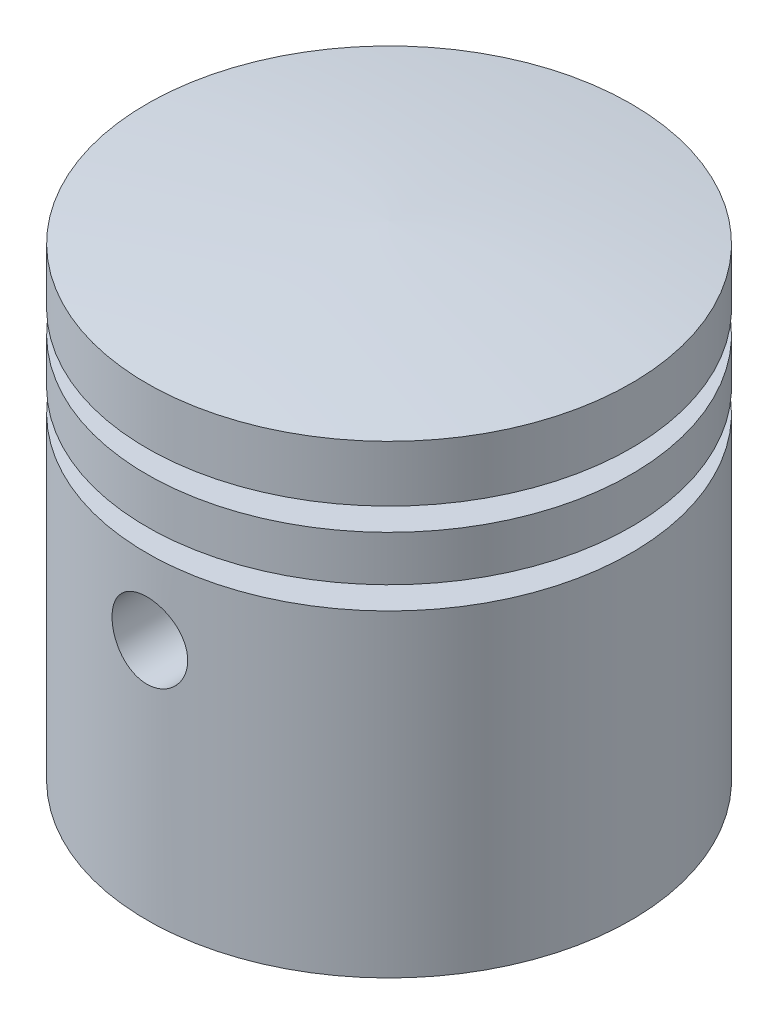
ISO-10303-21;
HEADER;
FILE_DESCRIPTION(('STEP AP214'),'2;1');
FILE_NAME('part.step','',(''),(''),'','','');
FILE_SCHEMA(('AUTOMOTIVE_DESIGN { 1 0 10303 214 1 1 1 1 }'));
ENDSEC;
DATA;
#1=APPLICATION_CONTEXT('core data for automotive mechanical design processes');
#2=APPLICATION_PROTOCOL_DEFINITION('international standard','automotive_design',2000,#1);
#3=PRODUCT_CONTEXT('',#1,'mechanical');
#4=PRODUCT('Part','Part','',(#3));
#5=PRODUCT_RELATED_PRODUCT_CATEGORY('part','',(#4));
#6=PRODUCT_DEFINITION_FORMATION('','',#4);
#7=PRODUCT_DEFINITION_CONTEXT('part definition',#1,'design');
#8=PRODUCT_DEFINITION('design','',#6,#7);
#9=PRODUCT_DEFINITION_SHAPE('','',#8);
#10=(LENGTH_UNIT() NAMED_UNIT(*) SI_UNIT(.MILLI.,.METRE.));
#11=(NAMED_UNIT(*) PLANE_ANGLE_UNIT() SI_UNIT($,.RADIAN.));
#12=(NAMED_UNIT(*) SI_UNIT($,.STERADIAN.) SOLID_ANGLE_UNIT());
#13=UNCERTAINTY_MEASURE_WITH_UNIT(LENGTH_MEASURE(1.E-05),#10,'distance_accuracy_value','');
#14=(GEOMETRIC_REPRESENTATION_CONTEXT(3) GLOBAL_UNCERTAINTY_ASSIGNED_CONTEXT((#13)) GLOBAL_UNIT_ASSIGNED_CONTEXT((#10,
#11,#12)) REPRESENTATION_CONTEXT('',''));
#15=CARTESIAN_POINT('',(0.,0.,0.));
#16=DIRECTION('',(0.,0.,1.));
#17=DIRECTION('',(1.,0.,0.));
#18=AXIS2_PLACEMENT_3D('',#15,#16,#17);
#19=CARTESIAN_POINT('',(0.,-130.481483382478,5.07547339878505));
#20=DIRECTION('',(-1.,0.,0.));
#21=DIRECTION('',(0.,0.,-1.));
#22=AXIS2_PLACEMENT_3D('',#19,#20,#21);
#23=CIRCLE('',#22,162.560735949344);
#24=TRIMMED_CURVE('',#23,(PARAMETER_VALUE(-1.53956923903449)),
(PARAMETER_VALUE(1.53956923903449)),.T.,.PARAMETER.);
#25=CARTESIAN_POINT('',(0.,-130.481483382478,0.));
#26=DIRECTION('',(0.,-1.,0.));
#27=AXIS1_PLACEMENT('',#25,#26);
#28=SURFACE_OF_REVOLUTION('',#24,#27);
#29=CARTESIAN_POINT('',(0.,30.7072795428865,0.));
#30=DIRECTION('',(0.,-1.,0.));
#31=DIRECTION('',(0.,0.,-1.));
#32=AXIS2_PLACEMENT_3D('',#29,#30,#31);
#33=CIRCLE('',#32,16.);
#34=CARTESIAN_POINT('',(0.,30.7072795428865,-16.));
#35=VERTEX_POINT('',#34);
#36=EDGE_CURVE('E59',#35,#35,#33,.T.);
#37=ORIENTED_EDGE('',*,*,#36,.F.);
#38=EDGE_LOOP('',(#37));
#39=FACE_BOUND('',#38,.T.);
#40=CARTESIAN_POINT('',(0.,32.,0.));
#41=VERTEX_POINT('',#40);
#42=VERTEX_LOOP('',#41);
#43=FACE_BOUND('',#42,.T.);
#44=ADVANCED_FACE('F33',(#39,#43),#28,.T.);
#45=CARTESIAN_POINT('',(0.,0.,16.));
#46=DIRECTION('',(0.,1.,0.));
#47=DIRECTION('',(0.,0.,1.));
#48=AXIS2_PLACEMENT_3D('',#45,#46,#47);
#49=PLANE('',#48);
#50=CARTESIAN_POINT('',(0.,0.,0.));
#51=DIRECTION('',(0.,-1.,0.));
#52=DIRECTION('',(0.,0.,-1.));
#53=AXIS2_PLACEMENT_3D('',#50,#51,#52);
#54=CIRCLE('',#53,13.);
#55=CARTESIAN_POINT('',(0.,0.,-13.));
#56=VERTEX_POINT('',#55);
#57=EDGE_CURVE('E68',#56,#56,#54,.T.);
#58=ORIENTED_EDGE('',*,*,#57,.F.);
#59=EDGE_LOOP('',(#58));
#60=FACE_BOUND('',#59,.T.);
#61=CARTESIAN_POINT('',(0.,0.,0.));
#62=DIRECTION('',(0.,-1.,0.));
#63=DIRECTION('',(0.,0.,-1.));
#64=AXIS2_PLACEMENT_3D('',#61,#62,#63);
#65=CIRCLE('',#64,16.);
#66=CARTESIAN_POINT('',(0.,0.,-16.));
#67=VERTEX_POINT('',#66);
#68=EDGE_CURVE('E11',#67,#67,#65,.T.);
#69=ORIENTED_EDGE('',*,*,#68,.T.);
#70=EDGE_LOOP('',(#69));
#71=FACE_BOUND('',#70,.T.);
#72=ADVANCED_FACE('F50',(#60,#71),#49,.F.);
#73=CARTESIAN_POINT('',(0.,0.,0.));
#74=DIRECTION('',(0.,-1.,0.));
#75=DIRECTION('',(0.,0.,-1.));
#76=AXIS2_PLACEMENT_3D('',#73,#74,#75);
#77=CYLINDRICAL_SURFACE('',#76,16.);
#78=CARTESIAN_POINT('',(0.,18.5,-16.));
#79=CARTESIAN_POINT('',(-0.139515097271033,18.4999943017285,-15.9999977019448));
#80=CARTESIAN_POINT('',(-0.279109404865704,18.4882818862264,-15.9981561248574));
#81=CARTESIAN_POINT('',(-0.554391314978102,18.4417563087232,-15.9909869809759));
#82=CARTESIAN_POINT('',(-0.690075061323317,18.4069211074965,-15.9856560884472));
#83=CARTESIAN_POINT('',(-0.953512538047403,18.3152203371934,-15.9721069716578));
#84=CARTESIAN_POINT('',(-1.0812723522899,18.2583719186384,-15.9638909956317));
#85=CARTESIAN_POINT('',(-1.3254212510446,18.1243014548584,-15.9454779403815));
#86=CARTESIAN_POINT('',(-1.44181181036831,18.0470820569641,-15.9352811186255));
#87=CARTESIAN_POINT('',(-1.66091991165162,17.873766951646,-15.9139426841436));
#88=CARTESIAN_POINT('',(-1.76352747914264,17.7775330051098,-15.9027945139234));
#89=CARTESIAN_POINT('',(-1.95120768822823,17.5692180517311,-15.8808607613029));
#90=CARTESIAN_POINT('',(-2.03627928654192,17.4571361026998,-15.8700752005075));
#91=CARTESIAN_POINT('',(-2.18690544328884,17.2195617286563,-15.8500242812745));
#92=CARTESIAN_POINT('',(-2.25235273557991,17.0940005176382,-15.840767397861));
#93=CARTESIAN_POINT('',(-2.36118681597065,16.8334985891422,-15.8249120174236));
#94=CARTESIAN_POINT('',(-2.40457491010063,16.6985584274894,-15.8183133630222));
#95=CARTESIAN_POINT('',(-2.46771559322167,16.4242890988562,-15.8085863451104));
#96=CARTESIAN_POINT('',(-2.48765705487496,16.2850044141812,-15.8054302653236));
#97=CARTESIAN_POINT('',(-2.50392369757621,16.0050328111074,-15.8028617107177));
#98=CARTESIAN_POINT('',(-2.50025034860466,15.864345980534,-15.8034490028802));
#99=CARTESIAN_POINT('',(-2.4695458080889,15.5869029681473,-15.8082755045521));
#100=CARTESIAN_POINT('',(-2.44272562959693,15.4501227766469,-15.8124817218495));
#101=CARTESIAN_POINT('',(-2.36681937833751,15.1830279936407,-15.8240205634547));
#102=CARTESIAN_POINT('',(-2.31773262684132,15.0527135993595,-15.8313532830641));
#103=CARTESIAN_POINT('',(-2.19846916949384,14.8016112873228,-15.8483550685462));
#104=CARTESIAN_POINT('',(-2.12820372315549,14.6808662082269,-15.8580339308724));
#105=CARTESIAN_POINT('',(-1.96864058146637,14.4528004643145,-15.878630461501));
#106=CARTESIAN_POINT('',(-1.87934153253017,14.3454807551125,-15.8895482178821));
#107=CARTESIAN_POINT('',(-1.68309088822333,14.1460897533667,-15.911537862489));
#108=CARTESIAN_POINT('',(-1.57595800560539,14.0541968417305,-15.9226101363559));
#109=CARTESIAN_POINT('',(-1.34769694737936,13.8896668543601,-15.9435512534783));
#110=CARTESIAN_POINT('',(-1.22656870068132,13.8170298764432,-15.9534200906202));
#111=CARTESIAN_POINT('',(-0.973595927056492,13.6930619265776,-15.9708539902704));
#112=CARTESIAN_POINT('',(-0.841744186240461,13.641745441467,-15.9784174854193));
#113=CARTESIAN_POINT('',(-0.57114953469676,13.5620340325528,-15.9903756000068));
#114=CARTESIAN_POINT('',(-0.432407130687201,13.5336374259335,-15.9947704520898));
#115=CARTESIAN_POINT('',(-0.153508336763736,13.5008107235498,-15.9998651172728));
#116=CARTESIAN_POINT('',(-0.0133814615087031,13.4961355210238,-16.0006027179286));
#117=CARTESIAN_POINT('',(0.265654546411641,13.510232705336,-15.9984028649127));
#118=CARTESIAN_POINT('',(0.404563719925155,13.5290043025891,-15.9954655349964));
#119=CARTESIAN_POINT('',(0.676473446265704,13.5892583876802,-15.9862692369322));
#120=CARTESIAN_POINT('',(0.809501262056041,13.6306207582677,-15.9800278421539));
#121=CARTESIAN_POINT('',(1.06673406785663,13.7347550943988,-15.9649207568356));
#122=CARTESIAN_POINT('',(1.19093861303941,13.7975281384427,-15.9560549341007));
#123=CARTESIAN_POINT('',(1.42807220225041,13.9432719911266,-15.9365897274094));
#124=CARTESIAN_POINT('',(1.54090512378373,14.0263974200905,-15.9259772866342));
#125=CARTESIAN_POINT('',(1.75110696507806,14.2102720859078,-15.9042388046444));
#126=CARTESIAN_POINT('',(1.84847490447018,14.3110224392049,-15.8931127309268));
#127=CARTESIAN_POINT('',(2.02588080776691,14.5283811972172,-15.8714802753665));
#128=CARTESIAN_POINT('',(2.10575398584126,14.6451248471223,-15.860980411908));
#129=CARTESIAN_POINT('',(2.2447556772664,14.8905160736613,-15.8419069280583));
#130=CARTESIAN_POINT('',(2.30388478778105,15.0191633074895,-15.83333325222));
#131=CARTESIAN_POINT('',(2.39946771944995,15.2842296407142,-15.8191307135236));
#132=CARTESIAN_POINT('',(2.43600654947912,15.4206174687656,-15.8134908234896));
#133=CARTESIAN_POINT('',(2.48564122040535,15.697689143664,-15.8057657028079));
#134=CARTESIAN_POINT('',(2.49873883084997,15.838372665419,-15.8036802038444));
#135=CARTESIAN_POINT('',(2.50107452690756,16.1183987159075,-15.8033105804488));
#136=CARTESIAN_POINT('',(2.49057180548425,16.2577390969335,-15.804985160429));
#137=CARTESIAN_POINT('',(2.44656223255901,16.5326452971443,-15.8118569894183));
#138=CARTESIAN_POINT('',(2.41305543086961,16.6682111245017,-15.8170542307995));
#139=CARTESIAN_POINT('',(2.32408329891851,16.9316378266405,-15.8303708885491));
#140=CARTESIAN_POINT('',(2.26863761738581,17.0595054782584,-15.8384876895341));
#141=CARTESIAN_POINT('',(2.13738768546417,17.3041656136763,-15.856731840474));
#142=CARTESIAN_POINT('',(2.06158262820886,17.4209576582884,-15.8668592701083));
#143=CARTESIAN_POINT('',(1.8908300813908,17.6414655441268,-15.8881156809226));
#144=CARTESIAN_POINT('',(1.79569107094768,17.7450321966138,-15.8992540116029));
#145=CARTESIAN_POINT('',(1.58937594638204,17.9348212363867,-15.9212004364073));
#146=CARTESIAN_POINT('',(1.47819612078433,18.0210395985919,-15.9320084534012));
#147=CARTESIAN_POINT('',(1.24216685884342,18.1741512230316,-15.952151024567));
#148=CARTESIAN_POINT('',(1.11723937214238,18.2409253727596,-15.9614763443027));
#149=CARTESIAN_POINT('',(0.857851882357786,18.3524409961929,-15.9775125983888));
#150=CARTESIAN_POINT('',(0.723401776581764,18.3972049725584,-15.9842262014212));
#151=CARTESIAN_POINT('',(0.490314239911595,18.4534330210906,-15.9927744586488));
#152=CARTESIAN_POINT('',(0.393105575651625,18.470868490629,-15.9954699162612));
#153=CARTESIAN_POINT('',(0.197277797850582,18.4941539133791,-15.9990834869762));
#154=CARTESIAN_POINT('',(0.0986587041691185,18.5000040295573,-16.0000016250796));
#155=CARTESIAN_POINT('',(0.,18.5,-16.));
#156=B_SPLINE_CURVE_WITH_KNOTS('',3,(#78,#79,#80,#81,#82,#83,#84,#85,#86,#87,#88,#89,#90,#91,
#92,#93,#94,#95,#96,#97,#98,#99,#100,#101,#102,#103,#104,#105,#106,#107,#108,#109,#110,#111,
#112,#113,#114,#115,#116,#117,#118,#119,#120,#121,#122,#123,#124,#125,#126,#127,#128,#129,#130,
#131,#132,#133,#134,#135,#136,#137,#138,#139,#140,#141,#142,#143,#144,#145,#146,#147,#148,#149,
#150,#151,#152,#153,#154,#155),.UNSPECIFIED.,.T.,.F.,(4,2,2,2,2,2,2,2,2,2,2,2,2,2,2,2,2,2,2,2,2,
2,2,2,2,2,2,2,2,2,2,2,2,2,2,2,2,2,4),(0.,0.418184740477491,0.836768642528014,1.25502707944103,
1.6732311879203,2.09459568152199,2.51598523645422,2.93963778605759,3.36326525009238,
3.78345631134995,4.20362121670545,4.6199957602258,5.0363829965105,5.45453977402347,
5.87272629892068,6.29545732334367,6.71819049513827,7.14121043754564,7.56419931829866,
7.98280854005914,8.40140366528356,8.81779444756566,9.23420620742031,9.65388541469671,
10.0735912160142,10.4970948024959,10.9205861964898,11.3424741039513,11.764330162293,
12.1815758159869,12.598820566189,13.0156924696662,13.4325808967135,13.8538201231554,
14.275156971423,14.6990230419984,15.1224548565628,15.4181801635154,15.7139013105871),.UNSPECIFIED.);
#157=CARTESIAN_POINT('',(0.,18.5,-16.));
#158=VERTEX_POINT('',#157);
#159=EDGE_CURVE('E120',#158,#158,#156,.T.);
#160=ORIENTED_EDGE('',*,*,#159,.T.);
#161=EDGE_LOOP('',(#160));
#162=FACE_BOUND('',#161,.T.);
#163=CARTESIAN_POINT('',(2.5,16.,15.8034806292791));
#164=CARTESIAN_POINT('',(2.49999429179104,15.860496621659,15.8034830346332));
#165=CARTESIAN_POINT('',(2.48828377742084,15.7209140023147,15.8053478026579));
#166=CARTESIAN_POINT('',(2.44176643645043,15.4456563709971,15.8125997089632));
#167=CARTESIAN_POINT('',(2.40693752801736,15.3099852245206,15.8179902148259));
#168=CARTESIAN_POINT('',(2.31525516047132,15.0465744103556,15.8316684916183));
#169=CARTESIAN_POINT('',(2.25841914921921,14.9188285521292,15.8399539668268));
#170=CARTESIAN_POINT('',(2.12437791816389,14.6747031091579,15.8584858981599));
#171=CARTESIAN_POINT('',(2.04717531605122,14.5583220663405,15.8687321022282));
#172=CARTESIAN_POINT('',(1.8738773011091,14.3392035148487,15.8901303851737));
#173=CARTESIAN_POINT('',(1.77763988617499,14.2365789256004,15.9012888784461));
#174=CARTESIAN_POINT('',(1.56931080987672,14.0488657795701,15.9231973082665));
#175=CARTESIAN_POINT('',(1.45721825316848,13.9637782137757,15.9339472216983));
#176=CARTESIAN_POINT('',(1.21963429185761,13.8131351229589,15.9538946715316));
#177=CARTESIAN_POINT('',(1.09407592635729,13.7476839960255,15.9630838016344));
#178=CARTESIAN_POINT('',(0.833580171794754,13.6388420452749,15.978803149105));
#179=CARTESIAN_POINT('',(0.698643320136809,13.5954499586173,15.9853335186778));
#180=CARTESIAN_POINT('',(0.42438532544881,13.5323012810438,15.9949542857973));
#181=CARTESIAN_POINT('',(0.28510876016075,13.5123553509316,15.9980722260505));
#182=CARTESIAN_POINT('',(0.00515314355066963,13.4960769566966,16.0006113098095));
#183=CARTESIAN_POINT('',(-0.135525822989188,13.4997430736482,16.0000326754547));
#184=CARTESIAN_POINT('',(-0.413000089722152,13.5304359262779,15.9952657389868));
#185=CARTESIAN_POINT('',(-0.549818542575175,13.5572589388403,15.9911089169598));
#186=CARTESIAN_POINT('',(-0.816988375343492,13.6331840286226,15.9796877395528));
#187=CARTESIAN_POINT('',(-0.947339577352176,13.6822867183541,15.9724232987387));
#188=CARTESIAN_POINT('',(-1.19848742679247,13.8015836558601,15.9555491842028));
#189=CARTESIAN_POINT('',(-1.31924299071837,13.871863005428,15.9459300777042));
#190=CARTESIAN_POINT('',(-1.54732385653213,14.0314560806292,15.9254174702046));
#191=CARTESIAN_POINT('',(-1.65464819959324,14.120771163955,15.9145238783282));
#192=CARTESIAN_POINT('',(-1.85402198520023,14.3170334870733,15.8925387825556));
#193=CARTESIAN_POINT('',(-1.94589625613075,14.4241586663949,15.8814464071021));
#194=CARTESIAN_POINT('',(-2.11039226047485,14.6523975646821,15.8604269384475));
#195=CARTESIAN_POINT('',(-2.18301385538335,14.7735113842741,15.8504998536298));
#196=CARTESIAN_POINT('',(-2.30697060635685,15.0264796281058,15.8329349281613));
#197=CARTESIAN_POINT('',(-2.35828663884161,15.1583435750735,15.8252991458489));
#198=CARTESIAN_POINT('',(-2.43799343127668,15.4289648487055,15.8132168990948));
#199=CARTESIAN_POINT('',(-2.46638595195258,15.5677216450697,15.8087701897074));
#200=CARTESIAN_POINT('',(-2.49919719237856,15.8466281032752,15.8036163696886));
#201=CARTESIAN_POINT('',(-2.50386473411271,15.9867478001948,15.80287044806));
#202=CARTESIAN_POINT('',(-2.48975479033184,16.2657676352979,15.8050994977182));
#203=CARTESIAN_POINT('',(-2.47097809654328,16.4046678145059,15.8080743433524));
#204=CARTESIAN_POINT('',(-2.41072412555895,16.6765278074665,15.8173740105186));
#205=CARTESIAN_POINT('',(-2.36937178781979,16.8095159986396,15.8236803883335));
#206=CARTESIAN_POINT('',(-2.26527072241932,17.0666739711039,15.8389172439685));
#207=CARTESIAN_POINT('',(-2.20252085602949,17.190843282649,15.8478478614411));
#208=CARTESIAN_POINT('',(-2.05681199170293,17.4279512816488,15.8674179220711));
#209=CARTESIAN_POINT('',(-1.97369251093471,17.5407902289,15.8780706945976));
#210=CARTESIAN_POINT('',(-1.78982593995283,17.7510069808482,15.8998450469621));
#211=CARTESIAN_POINT('',(-1.6890777652142,17.848383833607,15.9109666556111));
#212=CARTESIAN_POINT('',(-1.47171546765808,18.0258112706355,15.9325473887455));
#213=CARTESIAN_POINT('',(-1.35496564158983,18.1056965764301,15.9429995842164));
#214=CARTESIAN_POINT('',(-1.10955861029337,18.2447195199902,15.9619548934084));
#215=CARTESIAN_POINT('',(-0.980901753162488,18.3038577640459,15.9704580640831));
#216=CARTESIAN_POINT('',(-0.715839663778322,18.3994462752842,15.9845269767683));
#217=CARTESIAN_POINT('',(-0.579467147617084,18.4359854974394,15.9901042225572));
#218=CARTESIAN_POINT('',(-0.302427949770741,18.4856261326728,15.9977412978946));
#219=CARTESIAN_POINT('',(-0.161761577654427,18.498729231356,15.9998013804089));
#220=CARTESIAN_POINT('',(0.118272165188273,18.5010818526552,16.0001691012796));
#221=CARTESIAN_POINT('',(0.257637428859789,18.4905837446428,15.9985164403994));
#222=CARTESIAN_POINT('',(0.532594595464885,18.4465746838196,15.9917247801431));
#223=CARTESIAN_POINT('',(0.668186513581643,18.4130638236216,15.9865857947973));
#224=CARTESIAN_POINT('',(0.931668850429403,18.3240727402876,15.9733964142131));
#225=CARTESIAN_POINT('',(1.05956579651625,18.2686114484191,15.965348528289));
#226=CARTESIAN_POINT('',(1.30427807253219,18.137321161478,15.947223323121));
#227=CARTESIAN_POINT('',(1.42109298145458,18.0614913930258,15.9371459268214));
#228=CARTESIAN_POINT('',(1.64160219185804,17.8907105567916,15.9159528222148));
#229=CARTESIAN_POINT('',(1.745151694824,17.795573685696,15.9048276353277));
#230=CARTESIAN_POINT('',(1.93490712736948,17.5892700426646,15.8828612878644));
#231=CARTESIAN_POINT('',(2.02110898563013,17.4780995182753,15.8720201944801));
#232=CARTESIAN_POINT('',(2.17420151541622,17.2420788957246,15.8517779742959));
#233=CARTESIAN_POINT('',(2.24097044145096,17.1171490413903,15.842386091806));
#234=CARTESIAN_POINT('',(2.35247565604314,16.85775678237,15.8262143333515));
#235=CARTESIAN_POINT('',(2.3972345005847,16.7233042988834,15.8194317848938));
#236=CARTESIAN_POINT('',(2.45344906957713,16.4902302603036,15.8107909670081));
#237=CARTESIAN_POINT('',(2.47087849275466,16.3930384000151,15.8080643798014));
#238=CARTESIAN_POINT('',(2.49415589078728,16.1972442189536,15.804408373768));
#239=CARTESIAN_POINT('',(2.50000403623692,16.0986419189782,15.8034789284691));
#240=CARTESIAN_POINT('',(2.5,16.,15.8034806292791));
#241=B_SPLINE_CURVE_WITH_KNOTS('',3,(#163,#164,#165,#166,#167,#168,#169,#170,#171,#172,#173,
#174,#175,#176,#177,#178,#179,#180,#181,#182,#183,#184,#185,#186,#187,#188,#189,#190,#191,#192,
#193,#194,#195,#196,#197,#198,#199,#200,#201,#202,#203,#204,#205,#206,#207,#208,#209,#210,#211,
#212,#213,#214,#215,#216,#217,#218,#219,#220,#221,#222,#223,#224,#225,#226,#227,#228,#229,#230,
#231,#232,#233,#234,#235,#236,#237,#238,#239,#240),.UNSPECIFIED.,.T.,.F.,(4,2,2,2,2,2,2,2,2,2,2,
2,2,2,2,2,2,2,2,2,2,2,2,2,2,2,2,2,2,2,2,2,2,2,2,2,2,2,4),(0.,0.418149527902241,
0.836699032574077,1.25491737645053,1.67308199345223,2.09449258051085,2.51592697424482,
2.93956378022295,3.36317633102573,3.78334397517517,4.20348637030326,4.61996979150785,
5.03646466334576,5.45465612930833,5.87287743207563,6.29556043395287,6.71824647655855,
7.1413111003865,7.56434322607051,7.98292940034458,8.40150143908464,8.81778013452041,
9.23408098683358,9.6537735283698,10.0734918986585,10.4970197199928,10.9205351635679,
11.3423727623224,11.7641800198745,12.18149834073,12.5988149821383,13.0157724881518,
13.432745828047,13.8539404040181,14.275233715164,14.6991122166338,15.1225554163993,
15.4182305458031,15.7139013198205),.UNSPECIFIED.);
#242=CARTESIAN_POINT('',(2.5,16.,15.8034806292791));
#243=VERTEX_POINT('',#242);
#244=EDGE_CURVE('E114',#243,#243,#241,.T.);
#245=ORIENTED_EDGE('',*,*,#244,.T.);
#246=EDGE_LOOP('',(#245));
#247=FACE_BOUND('',#246,.T.);
#248=ORIENTED_EDGE('',*,*,#68,.F.);
#249=EDGE_LOOP('',(#248));
#250=FACE_BOUND('',#249,.T.);
#251=CARTESIAN_POINT('',(0.,21.,0.));
#252=DIRECTION('',(0.,-1.,0.));
#253=DIRECTION('',(0.,0.,-1.));
#254=AXIS2_PLACEMENT_3D('',#251,#252,#253);
#255=CIRCLE('',#254,16.);
#256=CARTESIAN_POINT('',(0.,21.,-16.));
#257=VERTEX_POINT('',#256);
#258=EDGE_CURVE('E45',#257,#257,#255,.T.);
#259=ORIENTED_EDGE('',*,*,#258,.T.);
#260=EDGE_LOOP('',(#259));
#261=FACE_BOUND('',#260,.T.);
#262=ADVANCED_FACE('F55',(#162,#247,#250,#261),#77,.T.);
#263=CARTESIAN_POINT('',(0.,21.,12.5137254901961));
#264=DIRECTION('',(0.,-1.,0.));
#265=DIRECTION('',(0.,0.,-1.));
#266=AXIS2_PLACEMENT_3D('',#263,#264,#265);
#267=PLANE('',#266);
#268=ORIENTED_EDGE('',*,*,#258,.F.);
#269=EDGE_LOOP('',(#268));
#270=FACE_BOUND('',#269,.T.);
#271=CARTESIAN_POINT('',(0.,21.,0.));
#272=DIRECTION('',(0.,-1.,0.));
#273=DIRECTION('',(0.,0.,-1.));
#274=AXIS2_PLACEMENT_3D('',#271,#272,#273);
#275=CIRCLE('',#274,12.5137254901961);
#276=CARTESIAN_POINT('',(0.,21.,-12.5137254901961));
#277=VERTEX_POINT('',#276);
#278=EDGE_CURVE('E86',#277,#277,#275,.T.);
#279=ORIENTED_EDGE('',*,*,#278,.T.);
#280=EDGE_LOOP('',(#279));
#281=FACE_BOUND('',#280,.T.);
#282=ADVANCED_FACE('F128',(#270,#281),#267,.F.);
#283=CARTESIAN_POINT('',(0.,0.,0.));
#284=DIRECTION('',(0.,-1.,0.));
#285=DIRECTION('',(0.,0.,-1.));
#286=AXIS2_PLACEMENT_3D('',#283,#284,#285);
#287=CYLINDRICAL_SURFACE('',#286,12.5137254901961);
#288=ORIENTED_EDGE('',*,*,#278,.F.);
#289=EDGE_LOOP('',(#288));
#290=FACE_BOUND('',#289,.T.);
#291=CARTESIAN_POINT('',(0.,22.5,0.));
#292=DIRECTION('',(0.,-1.,0.));
#293=DIRECTION('',(0.,0.,-1.));
#294=AXIS2_PLACEMENT_3D('',#291,#292,#293);
#295=CIRCLE('',#294,12.5137254901961);
#296=CARTESIAN_POINT('',(0.,22.5,-12.5137254901961));
#297=VERTEX_POINT('',#296);
#298=EDGE_CURVE('E83',#297,#297,#295,.T.);
#299=ORIENTED_EDGE('',*,*,#298,.T.);
#300=EDGE_LOOP('',(#299));
#301=FACE_BOUND('',#300,.T.);
#302=ADVANCED_FACE('F133',(#290,#301),#287,.T.);
#303=CARTESIAN_POINT('',(0.,22.5,16.));
#304=DIRECTION('',(0.,1.,0.));
#305=DIRECTION('',(0.,0.,1.));
#306=AXIS2_PLACEMENT_3D('',#303,#304,#305);
#307=PLANE('',#306);
#308=ORIENTED_EDGE('',*,*,#298,.F.);
#309=EDGE_LOOP('',(#308));
#310=FACE_BOUND('',#309,.T.);
#311=CARTESIAN_POINT('',(0.,22.5,0.));
#312=DIRECTION('',(0.,-1.,0.));
#313=DIRECTION('',(0.,0.,-1.));
#314=AXIS2_PLACEMENT_3D('',#311,#312,#313);
#315=CIRCLE('',#314,16.);
#316=CARTESIAN_POINT('',(0.,22.5,-16.));
#317=VERTEX_POINT('',#316);
#318=EDGE_CURVE('E80',#317,#317,#315,.T.);
#319=ORIENTED_EDGE('',*,*,#318,.T.);
#320=EDGE_LOOP('',(#319));
#321=FACE_BOUND('',#320,.T.);
#322=ADVANCED_FACE('F137',(#310,#321),#307,.F.);
#323=CARTESIAN_POINT('',(0.,0.,0.));
#324=DIRECTION('',(0.,-1.,0.));
#325=DIRECTION('',(0.,0.,-1.));
#326=AXIS2_PLACEMENT_3D('',#323,#324,#325);
#327=CYLINDRICAL_SURFACE('',#326,16.);
#328=ORIENTED_EDGE('',*,*,#318,.F.);
#329=EDGE_LOOP('',(#328));
#330=FACE_BOUND('',#329,.T.);
#331=CARTESIAN_POINT('',(0.,25.5,0.));
#332=DIRECTION('',(0.,-1.,0.));
#333=DIRECTION('',(0.,0.,-1.));
#334=AXIS2_PLACEMENT_3D('',#331,#332,#333);
#335=CIRCLE('',#334,16.);
#336=CARTESIAN_POINT('',(0.,25.5,-16.));
#337=VERTEX_POINT('',#336);
#338=EDGE_CURVE('E77',#337,#337,#335,.T.);
#339=ORIENTED_EDGE('',*,*,#338,.T.);
#340=EDGE_LOOP('',(#339));
#341=FACE_BOUND('',#340,.T.);
#342=ADVANCED_FACE('F141',(#330,#341),#327,.T.);
#343=CARTESIAN_POINT('',(0.,25.5,12.5137254901961));
#344=DIRECTION('',(0.,-1.,0.));
#345=DIRECTION('',(0.,0.,-1.));
#346=AXIS2_PLACEMENT_3D('',#343,#344,#345);
#347=PLANE('',#346);
#348=ORIENTED_EDGE('',*,*,#338,.F.);
#349=EDGE_LOOP('',(#348));
#350=FACE_BOUND('',#349,.T.);
#351=CARTESIAN_POINT('',(0.,25.5,0.));
#352=DIRECTION('',(0.,-1.,0.));
#353=DIRECTION('',(0.,0.,-1.));
#354=AXIS2_PLACEMENT_3D('',#351,#352,#353);
#355=CIRCLE('',#354,12.5137254901961);
#356=CARTESIAN_POINT('',(0.,25.5,-12.5137254901961));
#357=VERTEX_POINT('',#356);
#358=EDGE_CURVE('E74',#357,#357,#355,.T.);
#359=ORIENTED_EDGE('',*,*,#358,.T.);
#360=EDGE_LOOP('',(#359));
#361=FACE_BOUND('',#360,.T.);
#362=ADVANCED_FACE('F145',(#350,#361),#347,.F.);
#363=CARTESIAN_POINT('',(0.,0.,0.));
#364=DIRECTION('',(0.,-1.,0.));
#365=DIRECTION('',(0.,0.,-1.));
#366=AXIS2_PLACEMENT_3D('',#363,#364,#365);
#367=CYLINDRICAL_SURFACE('',#366,12.5137254901961);
#368=ORIENTED_EDGE('',*,*,#358,.F.);
#369=EDGE_LOOP('',(#368));
#370=FACE_BOUND('',#369,.T.);
#371=CARTESIAN_POINT('',(0.,27.,0.));
#372=DIRECTION('',(0.,-1.,0.));
#373=DIRECTION('',(0.,0.,-1.));
#374=AXIS2_PLACEMENT_3D('',#371,#372,#373);
#375=CIRCLE('',#374,12.5137254901961);
#376=CARTESIAN_POINT('',(0.,27.,-12.5137254901961));
#377=VERTEX_POINT('',#376);
#378=EDGE_CURVE('E65',#377,#377,#375,.T.);
#379=ORIENTED_EDGE('',*,*,#378,.T.);
#380=EDGE_LOOP('',(#379));
#381=FACE_BOUND('',#380,.T.);
#382=ADVANCED_FACE('F149',(#370,#381),#367,.T.);
#383=CARTESIAN_POINT('',(0.,27.,16.));
#384=DIRECTION('',(0.,1.,0.));
#385=DIRECTION('',(0.,0.,1.));
#386=AXIS2_PLACEMENT_3D('',#383,#384,#385);
#387=PLANE('',#386);
#388=ORIENTED_EDGE('',*,*,#378,.F.);
#389=EDGE_LOOP('',(#388));
#390=FACE_BOUND('',#389,.T.);
#391=CARTESIAN_POINT('',(0.,27.,0.));
#392=DIRECTION('',(0.,-1.,0.));
#393=DIRECTION('',(0.,0.,-1.));
#394=AXIS2_PLACEMENT_3D('',#391,#392,#393);
#395=CIRCLE('',#394,16.);
#396=CARTESIAN_POINT('',(0.,27.,-16.));
#397=VERTEX_POINT('',#396);
#398=EDGE_CURVE('E61',#397,#397,#395,.T.);
#399=ORIENTED_EDGE('',*,*,#398,.T.);
#400=EDGE_LOOP('',(#399));
#401=FACE_BOUND('',#400,.T.);
#402=ADVANCED_FACE('F153',(#390,#401),#387,.F.);
#403=CARTESIAN_POINT('',(0.,0.,0.));
#404=DIRECTION('',(0.,-1.,0.));
#405=DIRECTION('',(0.,0.,-1.));
#406=AXIS2_PLACEMENT_3D('',#403,#404,#405);
#407=CYLINDRICAL_SURFACE('',#406,16.);
#408=ORIENTED_EDGE('',*,*,#398,.F.);
#409=EDGE_LOOP('',(#408));
#410=FACE_BOUND('',#409,.T.);
#411=ORIENTED_EDGE('',*,*,#36,.T.);
#412=EDGE_LOOP('',(#411));
#413=FACE_BOUND('',#412,.T.);
#414=ADVANCED_FACE('F157',(#410,#413),#407,.T.);
#415=CARTESIAN_POINT('',(0.,10.,0.));
#416=DIRECTION('',(0.,-1.,0.));
#417=DIRECTION('',(0.,0.,-1.));
#418=AXIS2_PLACEMENT_3D('',#415,#416,#417);
#419=CYLINDRICAL_SURFACE('',#418,13.);
#420=CARTESIAN_POINT('',(0.,10.,0.));
#421=DIRECTION('',(0.,-1.,0.));
#422=DIRECTION('',(0.,0.,-1.));
#423=AXIS2_PLACEMENT_3D('',#420,#421,#422);
#424=CIRCLE('',#423,13.);
#425=CARTESIAN_POINT('',(0.,10.,-13.));
#426=VERTEX_POINT('',#425);
#427=EDGE_CURVE('E62',#426,#426,#424,.T.);
#428=ORIENTED_EDGE('',*,*,#427,.F.);
#429=EDGE_LOOP('',(#428));
#430=FACE_BOUND('',#429,.T.);
#431=ORIENTED_EDGE('',*,*,#57,.T.);
#432=EDGE_LOOP('',(#431));
#433=FACE_BOUND('',#432,.T.);
#434=ADVANCED_FACE('F161',(#430,#433),#419,.F.);
#435=CARTESIAN_POINT('',(0.,10.,0.));
#436=DIRECTION('',(0.,-1.,0.));
#437=DIRECTION('',(0.,0.,-1.));
#438=AXIS2_PLACEMENT_3D('',#435,#436,#437);
#439=PLANE('',#438);
#440=CARTESIAN_POINT('',(0.,10.,0.));
#441=DIRECTION('',(0.,-1.,0.));
#442=DIRECTION('',(0.,0.,-1.));
#443=AXIS2_PLACEMENT_3D('',#440,#441,#442);
#444=CIRCLE('',#443,10.);
#445=CARTESIAN_POINT('',(0.,10.,-10.));
#446=VERTEX_POINT('',#445);
#447=EDGE_CURVE('E91',#446,#446,#444,.T.);
#448=ORIENTED_EDGE('',*,*,#447,.F.);
#449=EDGE_LOOP('',(#448));
#450=FACE_BOUND('',#449,.T.);
#451=ORIENTED_EDGE('',*,*,#427,.T.);
#452=EDGE_LOOP('',(#451));
#453=FACE_BOUND('',#452,.T.);
#454=ADVANCED_FACE('F164',(#450,#453),#439,.T.);
#455=CARTESIAN_POINT('',(0.,24.,0.));
#456=DIRECTION('',(0.,-1.,0.));
#457=DIRECTION('',(0.,0.,-1.));
#458=AXIS2_PLACEMENT_3D('',#455,#456,#457);
#459=CYLINDRICAL_SURFACE('',#458,10.);
#460=CARTESIAN_POINT('',(0.,18.5,-10.));
#461=CARTESIAN_POINT('',(0.138126814449552,18.4999961237697,-9.99999766446687));
#462=CARTESIAN_POINT('',(0.276296929717938,18.4885140820437,-9.99710963553044));
#463=CARTESIAN_POINT('',(0.548677206284221,18.442958081155,-9.98586856383157));
#464=CARTESIAN_POINT('',(0.682885078117899,18.4088713174369,-9.97751242366627));
#465=CARTESIAN_POINT('',(0.943368120304295,18.3192679108965,-9.9562604388672));
#466=CARTESIAN_POINT('',(1.06965260571667,18.2637770021412,-9.94337004736764));
#467=CARTESIAN_POINT('',(1.31112021984071,18.1330310165919,-9.91442239679369));
#468=CARTESIAN_POINT('',(1.42630297391461,18.0577752731351,-9.89836503090261));
#469=CARTESIAN_POINT('',(1.64466987883486,17.8879986839097,-9.86445689319489));
#470=CARTESIAN_POINT('',(1.74759281676843,17.7931473750682,-9.84657845246877));
#471=CARTESIAN_POINT('',(1.93624821200553,17.5875796584849,-9.8112270019656));
#472=CARTESIAN_POINT('',(2.02197872824865,17.4768614617551,-9.79375403816446));
#473=CARTESIAN_POINT('',(2.17504423799829,17.240674622105,-9.76091292830281));
#474=CARTESIAN_POINT('',(2.2420870265419,17.1150112819855,-9.74557990774685));
#475=CARTESIAN_POINT('',(2.35399484758457,16.8537526472333,-9.71915824696694));
#476=CARTESIAN_POINT('',(2.39886342573357,16.7181589444466,-9.70806892824031));
#477=CARTESIAN_POINT('',(2.46425806134127,16.4437608363306,-9.69167461160538));
#478=CARTESIAN_POINT('',(2.48525378055342,16.30507517327,-9.68625818328352));
#479=CARTESIAN_POINT('',(2.50376962511068,16.0260523850011,-9.68148937432652));
#480=CARTESIAN_POINT('',(2.50129356969685,15.8857155321798,-9.68213600713214));
#481=CARTESIAN_POINT('',(2.47331087439951,15.6109736537577,-9.68932009194695));
#482=CARTESIAN_POINT('',(2.44836390031772,15.4765072975578,-9.69571438345489));
#483=CARTESIAN_POINT('',(2.37704031150499,15.2137315818149,-9.71344516118448));
#484=CARTESIAN_POINT('',(2.33066217011565,15.0854226616185,-9.72478199948731));
#485=CARTESIAN_POINT('',(2.21731579656197,14.8371033062465,-9.75125189842765));
#486=CARTESIAN_POINT('',(2.1501444453882,14.717189713684,-9.76642212449693));
#487=CARTESIAN_POINT('',(1.99726046002491,14.4901354837386,-9.79882851409985));
#488=CARTESIAN_POINT('',(1.91154458134806,14.3829970865546,-9.81606503891047));
#489=CARTESIAN_POINT('',(1.72110570780203,14.181327307176,-9.85126467566485));
#490=CARTESIAN_POINT('',(1.61591043027643,14.0872425165644,-9.86923449130001));
#491=CARTESIAN_POINT('',(1.39101986250617,13.9179645958935,-9.90343275964594));
#492=CARTESIAN_POINT('',(1.27132412951324,13.8427720428941,-9.91966115915679));
#493=CARTESIAN_POINT('',(1.02019314780232,13.7132490229594,-9.94862886823651));
#494=CARTESIAN_POINT('',(0.88871898868104,13.658991099576,-9.96135600212879));
#495=CARTESIAN_POINT('',(0.618126680238139,13.5734711571507,-9.98179861652361));
#496=CARTESIAN_POINT('',(0.479009998584142,13.5422047393031,-9.98951505565468));
#497=CARTESIAN_POINT('',(0.200899950650045,13.5042373907353,-9.99892498785624));
#498=CARTESIAN_POINT('',(0.061994533313684,13.4969282898745,-10.0007675584713));
#499=CARTESIAN_POINT('',(-0.215054791335847,13.5054150034258,-9.99864674690754));
#500=CARTESIAN_POINT('',(-0.353198766074326,13.5212087379986,-9.99468388736421));
#501=CARTESIAN_POINT('',(-0.622690447960816,13.5749515139856,-9.98149301878918));
#502=CARTESIAN_POINT('',(-0.754108531614582,13.6125687724616,-9.97234390309647));
#503=CARTESIAN_POINT('',(-1.00876215408753,13.7085118067141,-9.94981177723595));
#504=CARTESIAN_POINT('',(-1.13199686505442,13.7668396738554,-9.93642833949965));
#505=CARTESIAN_POINT('',(-1.36920522404972,13.9037268814578,-9.9065551321037));
#506=CARTESIAN_POINT('',(-1.48297573639294,13.9826268539943,-9.89001445610999));
#507=CARTESIAN_POINT('',(-1.69587768940552,14.1579831813286,-9.85574181979586));
#508=CARTESIAN_POINT('',(-1.79500659828875,14.2544425660294,-9.83800965421578));
#509=CARTESIAN_POINT('',(-1.97831761345414,14.4650032680728,-9.80281594932498));
#510=CARTESIAN_POINT('',(-2.06207311270184,14.5794795049993,-9.78537173637463));
#511=CARTESIAN_POINT('',(-2.20918459835604,14.8212210574476,-9.75321463970069));
#512=CARTESIAN_POINT('',(-2.27254149026901,14.9484858049507,-9.73850163474941));
#513=CARTESIAN_POINT('',(-2.37658570101223,15.2115095373437,-9.71363491194665));
#514=CARTESIAN_POINT('',(-2.41740732773931,15.3472127138538,-9.70345425375809));
#515=CARTESIAN_POINT('',(-2.47557609990489,15.6238493964255,-9.68877906706586));
#516=CARTESIAN_POINT('',(-2.49292837912652,15.7647817517024,-9.68428329504044));
#517=CARTESIAN_POINT('',(-2.50339765056083,16.0435350397694,-9.68158168701612));
#518=CARTESIAN_POINT('',(-2.49719649630131,16.1813290585441,-9.68319887888034));
#519=CARTESIAN_POINT('',(-2.46229546385366,16.4538398144438,-9.69213181672143));
#520=CARTESIAN_POINT('',(-2.43359603781098,16.5885566133553,-9.69944744817732));
#521=CARTESIAN_POINT('',(-2.35488553240495,16.8503474317764,-9.71885434473222));
#522=CARTESIAN_POINT('',(-2.30500234113404,16.9774621754006,-9.73091692061057));
#523=CARTESIAN_POINT('',(-2.18544152267504,17.2216089711893,-9.7584625954084));
#524=CARTESIAN_POINT('',(-2.11576115005696,17.3386396219781,-9.77394616867808));
#525=CARTESIAN_POINT('',(-1.95644624772858,17.5625910483368,-9.80709390439337));
#526=CARTESIAN_POINT('',(-1.86633860485376,17.6691684557066,-9.82480441386302));
#527=CARTESIAN_POINT('',(-1.66964895198288,17.8659117413257,-9.86013378743769));
#528=CARTESIAN_POINT('',(-1.56306303543524,17.9560737168549,-9.87775262878422));
#529=CARTESIAN_POINT('',(-1.33411264450432,18.1190188476077,-9.9112942607945));
#530=CARTESIAN_POINT('',(-1.21149737052731,18.1914576894526,-9.92718055609783));
#531=CARTESIAN_POINT('',(-0.955443432517459,18.3145791049009,-9.95508208291861));
#532=CARTESIAN_POINT('',(-0.8220126057279,18.3652772677476,-9.96710008666302));
#533=CARTESIAN_POINT('',(-0.574017088739121,18.4359530505494,-9.98413432609236));
#534=CARTESIAN_POINT('',(-0.460633618180115,18.4599187384224,-9.99004308421151));
#535=CARTESIAN_POINT('',(-0.231510119227139,18.4919432393699,-9.9979767538658));
#536=CARTESIAN_POINT('',(-0.115770268737694,18.5000032488422,-10.0000019575149));
#537=CARTESIAN_POINT('',(0.,18.5,-10.));
#538=B_SPLINE_CURVE_WITH_KNOTS('',3,(#460,#461,#462,#463,#464,#465,#466,#467,#468,#469,#470,
#471,#472,#473,#474,#475,#476,#477,#478,#479,#480,#481,#482,#483,#484,#485,#486,#487,#488,#489,
#490,#491,#492,#493,#494,#495,#496,#497,#498,#499,#500,#501,#502,#503,#504,#505,#506,#507,#508,
#509,#510,#511,#512,#513,#514,#515,#516,#517,#518,#519,#520,#521,#522,#523,#524,#525,#526,#527,
#528,#529,#530,#531,#532,#533,#534,#535,#536,#537),.UNSPECIFIED.,.T.,.F.,(4,2,2,2,2,2,2,2,2,2,2,
2,2,2,2,2,2,2,2,2,2,2,2,2,2,2,2,2,2,2,2,2,2,2,2,2,2,2,4),(0.,0.41395618745315,0.828147062939832,
1.24184150381018,1.65554990028221,2.07690725728565,2.4983121596677,2.92597745909678,
3.35357435282281,3.77260491835117,4.19156730193363,4.60037495017231,5.00921172448932,
5.42217546462,5.83521151399139,6.26002501620567,6.6848514926928,7.11113715020724,
7.53734122819939,7.95263848254328,8.36789835193439,8.7770045752893,9.18615212209352,
9.60255979281121,10.0190393835223,10.4457418201299,10.8724253125471,11.2965375769764,
11.7205570543048,12.1323963400748,12.5442273493652,12.9536066760888,13.3630428023797,
13.7831596069298,14.2033761629383,14.6312030917578,15.0587227304538,15.4057040491338,
15.752659267482),.UNSPECIFIED.);
#539=CARTESIAN_POINT('',(0.,18.5,-10.));
#540=VERTEX_POINT('',#539);
#541=EDGE_CURVE('E36',#540,#540,#538,.T.);
#542=ORIENTED_EDGE('',*,*,#541,.T.);
#543=EDGE_LOOP('',(#542));
#544=FACE_BOUND('',#543,.T.);
#545=CARTESIAN_POINT('',(2.5,16.,9.68245836551854));
#546=CARTESIAN_POINT('',(2.49999607859307,16.1380507509266,9.6824610008786));
#547=CARTESIAN_POINT('',(2.48852624549765,16.2761448986785,9.68544306014597));
#548=CARTESIAN_POINT('',(2.44302312546379,16.5483675781735,9.69701861992564));
#549=CARTESIAN_POINT('',(2.4089767067421,16.6824937544682,9.7056153862163));
#550=CARTESIAN_POINT('',(2.31949119963204,16.9428035381872,9.7273872459615));
#551=CARTESIAN_POINT('',(2.26407972785449,17.0689971553857,9.74055642690458));
#552=CARTESIAN_POINT('',(2.13352114126139,17.3103108525399,9.76998192028759));
#553=CARTESIAN_POINT('',(2.05837318856069,17.4254304620802,9.78623836378489));
#554=CARTESIAN_POINT('',(1.88870842731188,17.6438616452622,9.82040716355625));
#555=CARTESIAN_POINT('',(1.79383688770405,17.74689360035,9.83834597623034));
#556=CARTESIAN_POINT('',(1.58818206410066,17.9357613943603,9.87362875515294));
#557=CARTESIAN_POINT('',(1.47739729418031,18.0215956256217,9.89097266566388));
#558=CARTESIAN_POINT('',(1.24114520107896,18.1747754676313,9.92340415520582));
#559=CARTESIAN_POINT('',(1.11549457619512,18.2418463881615,9.93845687400592));
#560=CARTESIAN_POINT('',(0.854263184292763,18.3538096441531,9.96430811925984));
#561=CARTESIAN_POINT('',(0.718683885791941,18.3987052519155,9.97510727334345));
#562=CARTESIAN_POINT('',(0.444358758754161,18.4641478345786,9.9910475884818));
#563=CARTESIAN_POINT('',(0.305732719548975,18.4851696443266,9.99629893844314));
#564=CARTESIAN_POINT('',(0.026828819262769,18.5037583792756,10.000935941073));
#565=CARTESIAN_POINT('',(-0.113448794538069,18.5013287722096,10.000322460967));
#566=CARTESIAN_POINT('',(-0.388380617930968,18.4734251497499,9.99338094953534));
#567=CARTESIAN_POINT('',(-0.523090539002668,18.4484636749461,9.98718002340871));
#568=CARTESIAN_POINT('',(-0.786345618534216,18.3770287299515,9.96990836524857));
#569=CARTESIAN_POINT('',(-0.914890448426095,18.3305541146226,9.95883737398452));
#570=CARTESIAN_POINT('',(-1.16351675875452,18.2169974293129,9.93287509700884));
#571=CARTESIAN_POINT('',(-1.28351127441626,18.1497329553383,9.91795019695011));
#572=CARTESIAN_POINT('',(-1.51068905585122,17.9966443208837,9.88589903809692));
#573=CARTESIAN_POINT('',(-1.61787008771377,17.9108169314394,9.8687723965265));
#574=CARTESIAN_POINT('',(-1.81943508771239,17.7202912580176,9.83363713769356));
#575=CARTESIAN_POINT('',(-1.91339419768799,17.6151451076523,9.81561719525297));
#576=CARTESIAN_POINT('',(-2.08244093990755,17.3904000264597,9.78115043517327));
#577=CARTESIAN_POINT('',(-2.15752769011507,17.2708004205089,9.76470369108289));
#578=CARTESIAN_POINT('',(-2.28697032255647,17.0197099658511,9.73520496829319));
#579=CARTESIAN_POINT('',(-2.34122391742613,16.8881642696872,9.72216983717007));
#580=CARTESIAN_POINT('',(-2.42671405159096,16.6174145319232,9.70118640148669));
#581=CARTESIAN_POINT('',(-2.45795551638266,16.4782121360154,9.69323700842733));
#582=CARTESIAN_POINT('',(-2.49582963866592,16.2000404984701,9.68355356007457));
#583=CARTESIAN_POINT('',(-2.50309047391912,16.061162206659,9.68166088976933));
#584=CARTESIAN_POINT('',(-2.49451699051516,15.7841780634147,9.68387343364692));
#585=CARTESIAN_POINT('',(-2.4786847978498,15.6460721420506,9.687978095703));
#586=CARTESIAN_POINT('',(-2.42492546393825,15.3768857350514,9.7015708198498));
#587=CARTESIAN_POINT('',(-2.3873640682819,15.2457272734308,9.71096970242532));
#588=CARTESIAN_POINT('',(-2.29161808167046,14.9915685421467,9.73400718262805));
#589=CARTESIAN_POINT('',(-2.2334310477125,14.8685692409442,9.74764628246408));
#590=CARTESIAN_POINT('',(-2.0967706679366,14.6315587221331,9.77796137095511));
#591=CARTESIAN_POINT('',(-2.01792175383564,14.517771159957,9.79469168607245));
#592=CARTESIAN_POINT('',(-1.84265073233613,14.3048116371985,9.82917083071113));
#593=CARTESIAN_POINT('',(-1.7462257370136,14.2056420833499,9.84691982728307));
#594=CARTESIAN_POINT('',(-1.53565680246182,14.0221889574291,9.88197403031774));
#595=CARTESIAN_POINT('',(-1.42112988132898,13.9383399374512,9.8992570206188));
#596=CARTESIAN_POINT('',(-1.17925670673669,13.7910641330487,9.93097216613689));
#597=CARTESIAN_POINT('',(-1.05191112239398,13.7276362833918,9.94540447003949));
#598=CARTESIAN_POINT('',(-0.788895504327727,13.6235539654721,9.96970115738325));
#599=CARTESIAN_POINT('',(-0.653293452569706,13.5827357156209,9.97959830022409));
#600=CARTESIAN_POINT('',(-0.376874400797018,13.5245396653916,9.99385293395789));
#601=CARTESIAN_POINT('',(-0.236058412603102,13.507157341261,9.99821149393422));
#602=CARTESIAN_POINT('',(0.0427088161083075,13.4965810260612,10.0008542352202));
#603=CARTESIAN_POINT('',(0.180634567415054,13.5027457272615,9.99929947199971));
#604=CARTESIAN_POINT('',(0.453418741036876,13.5376195682359,9.99064741143608));
#605=CARTESIAN_POINT('',(0.588277254452321,13.5663280375329,9.98355027892922));
#606=CARTESIAN_POINT('',(0.850427589111935,13.6451305494272,9.96463582134723));
#607=CARTESIAN_POINT('',(0.977756236452157,13.6951086332859,9.95284411255981));
#608=CARTESIAN_POINT('',(1.22229263260406,13.8149264475489,9.92578222284145));
#609=CARTESIAN_POINT('',(1.33949910316408,13.8847686816762,9.91051160346894));
#610=CARTESIAN_POINT('',(1.56350482105826,14.0442880849903,9.87768124200718));
#611=CARTESIAN_POINT('',(1.66998747074584,14.1344003572596,9.86007542354161));
#612=CARTESIAN_POINT('',(1.86653755068376,14.3310571299434,9.82476622642974));
#613=CARTESIAN_POINT('',(1.95660081269148,14.4376057902779,9.80706282418256));
#614=CARTESIAN_POINT('',(2.11940506617958,14.6665035354736,9.77318689613756));
#615=CARTESIAN_POINT('',(2.19179154854095,14.7891103084131,9.75704909183222));
#616=CARTESIAN_POINT('',(2.31481724146367,15.045138724687,9.7285988873707));
#617=CARTESIAN_POINT('',(2.36547227438038,15.1785524152346,9.71628370583034));
#618=CARTESIAN_POINT('',(2.43605632142751,15.4264425295879,9.69879771876843));
#619=CARTESIAN_POINT('',(2.4599829264922,15.5397329109653,9.69271657508747));
#620=CARTESIAN_POINT('',(2.49195573142942,15.7686721724942,9.6845459645655));
#621=CARTESIAN_POINT('',(2.50000328592938,15.884320850611,9.68245615722769));
#622=CARTESIAN_POINT('',(2.5,16.,9.68245836551854));
#623=B_SPLINE_CURVE_WITH_KNOTS('',3,(#545,#546,#547,#548,#549,#550,#551,#552,#553,#554,#555,
#556,#557,#558,#559,#560,#561,#562,#563,#564,#565,#566,#567,#568,#569,#570,#571,#572,#573,#574,
#575,#576,#577,#578,#579,#580,#581,#582,#583,#584,#585,#586,#587,#588,#589,#590,#591,#592,#593,
#594,#595,#596,#597,#598,#599,#600,#601,#602,#603,#604,#605,#606,#607,#608,#609,#610,#611,#612,
#613,#614,#615,#616,#617,#618,#619,#620,#621,#622),.UNSPECIFIED.,.T.,.F.,(4,2,2,2,2,2,2,2,2,2,2,
2,2,2,2,2,2,2,2,2,2,2,2,2,2,2,2,2,2,2,2,2,2,2,2,2,2,2,4),(0.,0.413727441736142,
0.827695741428666,1.24113072716601,1.65458326755478,2.07623954192976,2.49793521479867,
2.9255149639792,3.35303159847092,3.77188750995347,4.19068148666021,4.60018262688947,
5.00970556724786,5.42292874254445,5.83622385468913,6.26070466571911,6.68520531199802,
7.11176432008403,7.53823200129548,7.95343574764204,8.36860127188747,8.77697405014152,
9.18539521426363,9.60182845864102,10.0183301888999,10.4452533097026,10.872154157245,
11.2959207281187,11.7196054891398,12.131834461324,12.5440511738193,12.9540487656466,
13.3640980574302,13.7839709658702,14.2039503157045,14.6317647729113,15.0592672137501,
15.4059782718572,15.7526597510792),.UNSPECIFIED.);
#624=CARTESIAN_POINT('',(2.5,16.,9.68245836551854));
#625=VERTEX_POINT('',#624);
#626=EDGE_CURVE('E94',#625,#625,#623,.T.);
#627=ORIENTED_EDGE('',*,*,#626,.T.);
#628=EDGE_LOOP('',(#627));
#629=FACE_BOUND('',#628,.T.);
#630=ORIENTED_EDGE('',*,*,#447,.T.);
#631=EDGE_LOOP('',(#630));
#632=FACE_BOUND('',#631,.T.);
#633=CARTESIAN_POINT('',(0.,24.,0.));
#634=DIRECTION('',(0.,-1.,0.));
#635=DIRECTION('',(0.,0.,-1.));
#636=AXIS2_PLACEMENT_3D('',#633,#634,#635);
#637=CIRCLE('',#636,10.);
#638=CARTESIAN_POINT('',(0.,24.,-10.));
#639=VERTEX_POINT('',#638);
#640=EDGE_CURVE('E93',#639,#639,#637,.T.);
#641=ORIENTED_EDGE('',*,*,#640,.F.);
#642=EDGE_LOOP('',(#641));
#643=FACE_BOUND('',#642,.T.);
#644=ADVANCED_FACE('F99',(#544,#629,#632,#643),#459,.F.);
#645=CARTESIAN_POINT('',(0.,24.,0.));
#646=DIRECTION('',(0.,-1.,0.));
#647=DIRECTION('',(0.,0.,-1.));
#648=AXIS2_PLACEMENT_3D('',#645,#646,#647);
#649=PLANE('',#648);
#650=ORIENTED_EDGE('',*,*,#640,.T.);
#651=EDGE_LOOP('',(#650));
#652=FACE_BOUND('',#651,.T.);
#653=ADVANCED_FACE('F108',(#652),#649,.T.);
#654=CARTESIAN_POINT('',(0.,16.,-16.));
#655=DIRECTION('',(0.,0.,1.));
#656=DIRECTION('',(1.,0.,0.));
#657=AXIS2_PLACEMENT_3D('',#654,#655,#656);
#658=CYLINDRICAL_SURFACE('',#657,2.5);
#659=ORIENTED_EDGE('',*,*,#626,.F.);
#660=EDGE_LOOP('',(#659));
#661=FACE_BOUND('',#660,.T.);
#662=ORIENTED_EDGE('',*,*,#244,.F.);
#663=EDGE_LOOP('',(#662));
#664=FACE_BOUND('',#663,.T.);
#665=ADVANCED_FACE('F106',(#661,#664),#658,.F.);
#666=ORIENTED_EDGE('',*,*,#541,.F.);
#667=EDGE_LOOP('',(#666));
#668=FACE_BOUND('',#667,.T.);
#669=ORIENTED_EDGE('',*,*,#159,.F.);
#670=EDGE_LOOP('',(#669));
#671=FACE_BOUND('',#670,.T.);
#672=ADVANCED_FACE('F103',(#668,#671),#658,.F.);
#673=CLOSED_SHELL('',(#44,#72,#262,#282,#302,#322,#342,#362,#382,#402,#414,#434,#454,#644,#653,
#665,#672));
#674=MANIFOLD_SOLID_BREP('B2',#673);
#675=ADVANCED_BREP_SHAPE_REPRESENTATION('',(#18,#674),#14);
#676=SHAPE_DEFINITION_REPRESENTATION(#9,#675);
ENDSEC;
END-ISO-10303-21;
